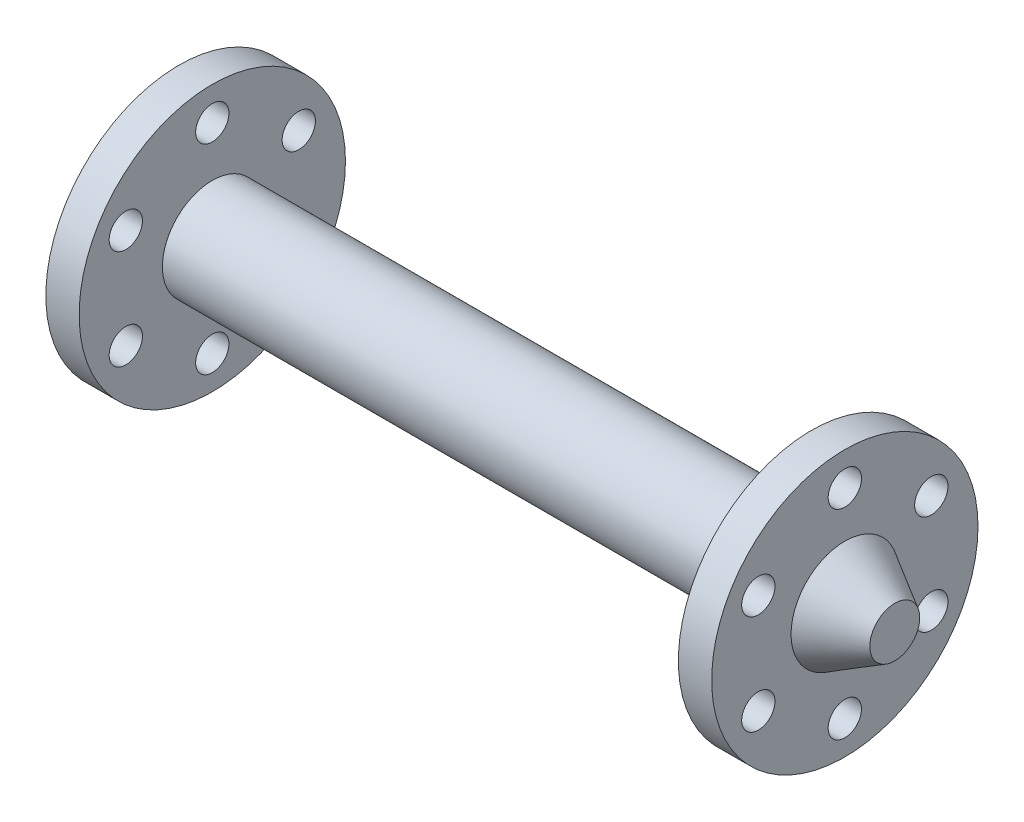
ISO-10303-21;
HEADER;
FILE_DESCRIPTION(('STEP AP214'),'2;1');
FILE_NAME('part.step','',(''),(''),'','','');
FILE_SCHEMA(('AUTOMOTIVE_DESIGN { 1 0 10303 214 1 1 1 1 }'));
ENDSEC;
DATA;
#1=APPLICATION_CONTEXT('core data for automotive mechanical design processes');
#2=APPLICATION_PROTOCOL_DEFINITION('international standard','automotive_design',2000,#1);
#3=PRODUCT_CONTEXT('',#1,'mechanical');
#4=PRODUCT('Part','Part','',(#3));
#5=PRODUCT_RELATED_PRODUCT_CATEGORY('part','',(#4));
#6=PRODUCT_DEFINITION_FORMATION('','',#4);
#7=PRODUCT_DEFINITION_CONTEXT('part definition',#1,'design');
#8=PRODUCT_DEFINITION('design','',#6,#7);
#9=PRODUCT_DEFINITION_SHAPE('','',#8);
#10=(LENGTH_UNIT() NAMED_UNIT(*) SI_UNIT(.MILLI.,.METRE.));
#11=(NAMED_UNIT(*) PLANE_ANGLE_UNIT() SI_UNIT($,.RADIAN.));
#12=(NAMED_UNIT(*) SI_UNIT($,.STERADIAN.) SOLID_ANGLE_UNIT());
#13=UNCERTAINTY_MEASURE_WITH_UNIT(LENGTH_MEASURE(1.E-05),#10,'distance_accuracy_value','');
#14=(GEOMETRIC_REPRESENTATION_CONTEXT(3) GLOBAL_UNCERTAINTY_ASSIGNED_CONTEXT((#13)) GLOBAL_UNIT_ASSIGNED_CONTEXT((#10,
#11,#12)) REPRESENTATION_CONTEXT('',''));
#15=CARTESIAN_POINT('',(0.,0.,0.));
#16=DIRECTION('',(0.,0.,1.));
#17=DIRECTION('',(1.,0.,0.));
#18=AXIS2_PLACEMENT_3D('',#15,#16,#17);
#19=CARTESIAN_POINT('',(0.,0.,0.));
#20=DIRECTION('',(1.,0.,0.));
#21=DIRECTION('',(0.,0.,-1.));
#22=AXIS2_PLACEMENT_3D('',#19,#20,#21);
#23=PLANE('',#22);
#24=CARTESIAN_POINT('',(0.,0.,0.));
#25=DIRECTION('',(-1.,0.,0.));
#26=DIRECTION('',(0.,0.,1.));
#27=AXIS2_PLACEMENT_3D('',#24,#25,#26);
#28=CIRCLE('',#27,15.);
#29=CARTESIAN_POINT('',(0.,0.,15.));
#30=VERTEX_POINT('',#29);
#31=EDGE_CURVE('E10',#30,#30,#28,.T.);
#32=ORIENTED_EDGE('',*,*,#31,.T.);
#33=EDGE_LOOP('',(#32));
#34=FACE_BOUND('',#33,.T.);
#35=ADVANCED_FACE('F43',(#34),#23,.F.);
#36=CARTESIAN_POINT('',(30.,0.,0.));
#37=DIRECTION('',(1.,0.,0.));
#38=DIRECTION('',(0.,0.,-1.));
#39=AXIS2_PLACEMENT_3D('',#36,#37,#38);
#40=CONICAL_SURFACE('',#39,32.3205080756885,0.523598775598293);
#41=ORIENTED_EDGE('',*,*,#31,.F.);
#42=EDGE_LOOP('',(#41));
#43=FACE_BOUND('',#42,.T.);
#44=CARTESIAN_POINT('',(30.,0.,0.));
#45=DIRECTION('',(-1.,0.,0.));
#46=DIRECTION('',(0.,0.,1.));
#47=AXIS2_PLACEMENT_3D('',#44,#45,#46);
#48=CIRCLE('',#47,32.3205080756885);
#49=CARTESIAN_POINT('',(30.,0.,32.3205080756885));
#50=VERTEX_POINT('',#49);
#51=EDGE_CURVE('E50',#50,#50,#48,.T.);
#52=ORIENTED_EDGE('',*,*,#51,.T.);
#53=EDGE_LOOP('',(#52));
#54=FACE_BOUND('',#53,.T.);
#55=ADVANCED_FACE('F203',(#43,#54),#40,.T.);
#56=CARTESIAN_POINT('',(50.,0.,0.));
#57=DIRECTION('',(-1.,0.,0.));
#58=DIRECTION('',(0.,0.,1.));
#59=AXIS2_PLACEMENT_3D('',#56,#57,#58);
#60=CYLINDRICAL_SURFACE('',#59,80.);
#61=CARTESIAN_POINT('',(50.,0.,0.));
#62=DIRECTION('',(1.,0.,0.));
#63=DIRECTION('',(0.,0.,-1.));
#64=AXIS2_PLACEMENT_3D('',#61,#62,#63);
#65=CIRCLE('',#64,80.);
#66=CARTESIAN_POINT('',(50.,0.,-80.));
#67=VERTEX_POINT('',#66);
#68=EDGE_CURVE('E55',#67,#67,#65,.T.);
#69=ORIENTED_EDGE('',*,*,#68,.F.);
#70=EDGE_LOOP('',(#69));
#71=FACE_BOUND('',#70,.T.);
#72=CARTESIAN_POINT('',(30.,0.,0.));
#73=DIRECTION('',(1.,0.,0.));
#74=DIRECTION('',(0.,0.,-1.));
#75=AXIS2_PLACEMENT_3D('',#72,#73,#74);
#76=CIRCLE('',#75,80.);
#77=CARTESIAN_POINT('',(30.,0.,-80.));
#78=VERTEX_POINT('',#77);
#79=EDGE_CURVE('E60',#78,#78,#76,.T.);
#80=ORIENTED_EDGE('',*,*,#79,.T.);
#81=EDGE_LOOP('',(#80));
#82=FACE_BOUND('',#81,.T.);
#83=ADVANCED_FACE('F207',(#71,#82),#60,.T.);
#84=CARTESIAN_POINT('',(50.,0.,0.));
#85=DIRECTION('',(1.,0.,0.));
#86=DIRECTION('',(0.,0.,-1.));
#87=AXIS2_PLACEMENT_3D('',#84,#85,#86);
#88=PLANE('',#87);
#89=CARTESIAN_POINT('',(50.,0.,0.));
#90=DIRECTION('',(1.,0.,0.));
#91=DIRECTION('',(0.,0.,-1.));
#92=AXIS2_PLACEMENT_3D('',#89,#90,#91);
#93=CIRCLE('',#92,30.);
#94=CARTESIAN_POINT('',(50.,0.,-30.));
#95=VERTEX_POINT('',#94);
#96=EDGE_CURVE('E115',#95,#95,#93,.T.);
#97=ORIENTED_EDGE('',*,*,#96,.F.);
#98=EDGE_LOOP('',(#97));
#99=FACE_BOUND('',#98,.T.);
#100=CARTESIAN_POINT('',(50.,60.,0.));
#101=DIRECTION('',(-1.,0.,0.));
#102=DIRECTION('',(0.,0.,1.));
#103=AXIS2_PLACEMENT_3D('',#100,#101,#102);
#104=CIRCLE('',#103,10.);
#105=CARTESIAN_POINT('',(50.,60.,10.));
#106=VERTEX_POINT('',#105);
#107=EDGE_CURVE('E65',#106,#106,#104,.T.);
#108=ORIENTED_EDGE('',*,*,#107,.T.);
#109=EDGE_LOOP('',(#108));
#110=FACE_BOUND('',#109,.T.);
#111=CARTESIAN_POINT('',(50.,30.0000000000006,-51.961524227066));
#112=DIRECTION('',(-1.,0.,0.));
#113=DIRECTION('',(0.,0.,1.));
#114=AXIS2_PLACEMENT_3D('',#111,#112,#113);
#115=CIRCLE('',#114,10.);
#116=CARTESIAN_POINT('',(50.,30.0000000000006,-41.961524227066));
#117=VERTEX_POINT('',#116);
#118=EDGE_CURVE('E101',#117,#117,#115,.T.);
#119=ORIENTED_EDGE('',*,*,#118,.T.);
#120=EDGE_LOOP('',(#119));
#121=FACE_BOUND('',#120,.T.);
#122=CARTESIAN_POINT('',(50.,-29.9999999999995,-51.9615242270666));
#123=DIRECTION('',(-1.,0.,0.));
#124=DIRECTION('',(0.,0.,1.));
#125=AXIS2_PLACEMENT_3D('',#122,#123,#124);
#126=CIRCLE('',#125,9.99999999999999);
#127=CARTESIAN_POINT('',(50.,-29.9999999999995,-41.9615242270666));
#128=VERTEX_POINT('',#127);
#129=EDGE_CURVE('E67',#128,#128,#126,.T.);
#130=ORIENTED_EDGE('',*,*,#129,.T.);
#131=EDGE_LOOP('',(#130));
#132=FACE_BOUND('',#131,.T.);
#133=CARTESIAN_POINT('',(50.,-60.,-4.18977760661176E-13));
#134=DIRECTION('',(-1.,0.,0.));
#135=DIRECTION('',(0.,0.,1.));
#136=AXIS2_PLACEMENT_3D('',#133,#134,#135);
#137=CIRCLE('',#136,10.);
#138=CARTESIAN_POINT('',(50.,-60.,9.99999999999958));
#139=VERTEX_POINT('',#138);
#140=EDGE_CURVE('E76',#139,#139,#137,.T.);
#141=ORIENTED_EDGE('',*,*,#140,.T.);
#142=EDGE_LOOP('',(#141));
#143=FACE_BOUND('',#142,.T.);
#144=CARTESIAN_POINT('',(50.,-30.0000000000002,51.9615242270662));
#145=DIRECTION('',(-1.,0.,0.));
#146=DIRECTION('',(0.,0.,1.));
#147=AXIS2_PLACEMENT_3D('',#144,#145,#146);
#148=CIRCLE('',#147,10.);
#149=CARTESIAN_POINT('',(50.,-30.0000000000002,61.9615242270662));
#150=VERTEX_POINT('',#149);
#151=EDGE_CURVE('E84',#150,#150,#148,.T.);
#152=ORIENTED_EDGE('',*,*,#151,.T.);
#153=EDGE_LOOP('',(#152));
#154=FACE_BOUND('',#153,.T.);
#155=CARTESIAN_POINT('',(50.,29.9999999999999,51.9615242270664));
#156=DIRECTION('',(-1.,0.,0.));
#157=DIRECTION('',(0.,0.,1.));
#158=AXIS2_PLACEMENT_3D('',#155,#156,#157);
#159=CIRCLE('',#158,10.);
#160=CARTESIAN_POINT('',(50.,29.9999999999999,61.9615242270664));
#161=VERTEX_POINT('',#160);
#162=EDGE_CURVE('E92',#161,#161,#159,.T.);
#163=ORIENTED_EDGE('',*,*,#162,.T.);
#164=EDGE_LOOP('',(#163));
#165=FACE_BOUND('',#164,.T.);
#166=ORIENTED_EDGE('',*,*,#68,.T.);
#167=EDGE_LOOP('',(#166));
#168=FACE_BOUND('',#167,.T.);
#169=ADVANCED_FACE('F212',(#99,#110,#121,#132,#143,#154,#165,#168),#88,.T.);
#170=CARTESIAN_POINT('',(30.,0.,0.));
#171=DIRECTION('',(1.,0.,0.));
#172=DIRECTION('',(0.,0.,-1.));
#173=AXIS2_PLACEMENT_3D('',#170,#171,#172);
#174=PLANE('',#173);
#175=CARTESIAN_POINT('',(30.,60.,0.));
#176=DIRECTION('',(-1.,0.,0.));
#177=DIRECTION('',(0.,0.,1.));
#178=AXIS2_PLACEMENT_3D('',#175,#176,#177);
#179=CIRCLE('',#178,10.);
#180=CARTESIAN_POINT('',(30.,60.,10.));
#181=VERTEX_POINT('',#180);
#182=EDGE_CURVE('E100',#181,#181,#179,.T.);
#183=ORIENTED_EDGE('',*,*,#182,.F.);
#184=EDGE_LOOP('',(#183));
#185=FACE_BOUND('',#184,.T.);
#186=CARTESIAN_POINT('',(30.,30.0000000000006,-51.961524227066));
#187=DIRECTION('',(-1.,0.,0.));
#188=DIRECTION('',(0.,0.,1.));
#189=AXIS2_PLACEMENT_3D('',#186,#187,#188);
#190=CIRCLE('',#189,10.);
#191=CARTESIAN_POINT('',(30.,30.0000000000006,-41.961524227066));
#192=VERTEX_POINT('',#191);
#193=EDGE_CURVE('E72',#192,#192,#190,.T.);
#194=ORIENTED_EDGE('',*,*,#193,.F.);
#195=EDGE_LOOP('',(#194));
#196=FACE_BOUND('',#195,.T.);
#197=CARTESIAN_POINT('',(30.,-29.9999999999995,-51.9615242270666));
#198=DIRECTION('',(-1.,0.,0.));
#199=DIRECTION('',(0.,0.,1.));
#200=AXIS2_PLACEMENT_3D('',#197,#198,#199);
#201=CIRCLE('',#200,9.99999999999999);
#202=CARTESIAN_POINT('',(30.,-29.9999999999995,-41.9615242270666));
#203=VERTEX_POINT('',#202);
#204=EDGE_CURVE('E71',#203,#203,#201,.T.);
#205=ORIENTED_EDGE('',*,*,#204,.F.);
#206=EDGE_LOOP('',(#205));
#207=FACE_BOUND('',#206,.T.);
#208=CARTESIAN_POINT('',(30.,-60.,-4.18977760661176E-13));
#209=DIRECTION('',(-1.,0.,0.));
#210=DIRECTION('',(0.,0.,1.));
#211=AXIS2_PLACEMENT_3D('',#208,#209,#210);
#212=CIRCLE('',#211,10.);
#213=CARTESIAN_POINT('',(30.,-60.,9.99999999999958));
#214=VERTEX_POINT('',#213);
#215=EDGE_CURVE('E80',#214,#214,#212,.T.);
#216=ORIENTED_EDGE('',*,*,#215,.F.);
#217=EDGE_LOOP('',(#216));
#218=FACE_BOUND('',#217,.T.);
#219=CARTESIAN_POINT('',(30.,-30.0000000000002,51.9615242270662));
#220=DIRECTION('',(-1.,0.,0.));
#221=DIRECTION('',(0.,0.,1.));
#222=AXIS2_PLACEMENT_3D('',#219,#220,#221);
#223=CIRCLE('',#222,10.);
#224=CARTESIAN_POINT('',(30.,-30.0000000000002,61.9615242270662));
#225=VERTEX_POINT('',#224);
#226=EDGE_CURVE('E88',#225,#225,#223,.T.);
#227=ORIENTED_EDGE('',*,*,#226,.F.);
#228=EDGE_LOOP('',(#227));
#229=FACE_BOUND('',#228,.T.);
#230=CARTESIAN_POINT('',(30.,29.9999999999999,51.9615242270664));
#231=DIRECTION('',(-1.,0.,0.));
#232=DIRECTION('',(0.,0.,1.));
#233=AXIS2_PLACEMENT_3D('',#230,#231,#232);
#234=CIRCLE('',#233,10.);
#235=CARTESIAN_POINT('',(30.,29.9999999999999,61.9615242270664));
#236=VERTEX_POINT('',#235);
#237=EDGE_CURVE('E96',#236,#236,#234,.T.);
#238=ORIENTED_EDGE('',*,*,#237,.F.);
#239=EDGE_LOOP('',(#238));
#240=FACE_BOUND('',#239,.T.);
#241=ORIENTED_EDGE('',*,*,#51,.F.);
#242=EDGE_LOOP('',(#241));
#243=FACE_BOUND('',#242,.T.);
#244=ORIENTED_EDGE('',*,*,#79,.F.);
#245=EDGE_LOOP('',(#244));
#246=FACE_BOUND('',#245,.T.);
#247=ADVANCED_FACE('F216',(#185,#196,#207,#218,#229,#240,#243,#246),#174,.F.);
#248=CARTESIAN_POINT('',(50.,29.9999999999999,51.9615242270664));
#249=DIRECTION('',(-1.,0.,0.));
#250=DIRECTION('',(0.,0.,1.));
#251=AXIS2_PLACEMENT_3D('',#248,#249,#250);
#252=CYLINDRICAL_SURFACE('',#251,10.);
#253=ORIENTED_EDGE('',*,*,#162,.F.);
#254=EDGE_LOOP('',(#253));
#255=FACE_BOUND('',#254,.T.);
#256=ORIENTED_EDGE('',*,*,#237,.T.);
#257=EDGE_LOOP('',(#256));
#258=FACE_BOUND('',#257,.T.);
#259=ADVANCED_FACE('F219',(#255,#258),#252,.F.);
#260=CARTESIAN_POINT('',(50.,-30.0000000000002,51.9615242270662));
#261=DIRECTION('',(-1.,0.,0.));
#262=DIRECTION('',(0.,0.,1.));
#263=AXIS2_PLACEMENT_3D('',#260,#261,#262);
#264=CYLINDRICAL_SURFACE('',#263,10.);
#265=ORIENTED_EDGE('',*,*,#151,.F.);
#266=EDGE_LOOP('',(#265));
#267=FACE_BOUND('',#266,.T.);
#268=ORIENTED_EDGE('',*,*,#226,.T.);
#269=EDGE_LOOP('',(#268));
#270=FACE_BOUND('',#269,.T.);
#271=ADVANCED_FACE('F232',(#267,#270),#264,.F.);
#272=CARTESIAN_POINT('',(50.,-60.,-4.18977760661176E-13));
#273=DIRECTION('',(-1.,0.,0.));
#274=DIRECTION('',(0.,0.,1.));
#275=AXIS2_PLACEMENT_3D('',#272,#273,#274);
#276=CYLINDRICAL_SURFACE('',#275,10.);
#277=ORIENTED_EDGE('',*,*,#140,.F.);
#278=EDGE_LOOP('',(#277));
#279=FACE_BOUND('',#278,.T.);
#280=ORIENTED_EDGE('',*,*,#215,.T.);
#281=EDGE_LOOP('',(#280));
#282=FACE_BOUND('',#281,.T.);
#283=ADVANCED_FACE('F228',(#279,#282),#276,.F.);
#284=CARTESIAN_POINT('',(50.,-29.9999999999995,-51.9615242270666));
#285=DIRECTION('',(-1.,0.,0.));
#286=DIRECTION('',(0.,0.,1.));
#287=AXIS2_PLACEMENT_3D('',#284,#285,#286);
#288=CYLINDRICAL_SURFACE('',#287,9.99999999999999);
#289=ORIENTED_EDGE('',*,*,#129,.F.);
#290=EDGE_LOOP('',(#289));
#291=FACE_BOUND('',#290,.T.);
#292=ORIENTED_EDGE('',*,*,#204,.T.);
#293=EDGE_LOOP('',(#292));
#294=FACE_BOUND('',#293,.T.);
#295=ADVANCED_FACE('F224',(#291,#294),#288,.F.);
#296=CARTESIAN_POINT('',(50.,30.0000000000006,-51.961524227066));
#297=DIRECTION('',(-1.,0.,0.));
#298=DIRECTION('',(0.,0.,1.));
#299=AXIS2_PLACEMENT_3D('',#296,#297,#298);
#300=CYLINDRICAL_SURFACE('',#299,10.);
#301=ORIENTED_EDGE('',*,*,#118,.F.);
#302=EDGE_LOOP('',(#301));
#303=FACE_BOUND('',#302,.T.);
#304=ORIENTED_EDGE('',*,*,#193,.T.);
#305=EDGE_LOOP('',(#304));
#306=FACE_BOUND('',#305,.T.);
#307=ADVANCED_FACE('F227',(#303,#306),#300,.F.);
#308=CARTESIAN_POINT('',(50.,60.,0.));
#309=DIRECTION('',(-1.,0.,0.));
#310=DIRECTION('',(0.,0.,1.));
#311=AXIS2_PLACEMENT_3D('',#308,#309,#310);
#312=CYLINDRICAL_SURFACE('',#311,10.);
#313=ORIENTED_EDGE('',*,*,#107,.F.);
#314=EDGE_LOOP('',(#313));
#315=FACE_BOUND('',#314,.T.);
#316=ORIENTED_EDGE('',*,*,#182,.T.);
#317=EDGE_LOOP('',(#316));
#318=FACE_BOUND('',#317,.T.);
#319=ADVANCED_FACE('F242',(#315,#318),#312,.F.);
#320=CARTESIAN_POINT('',(410.,0.,0.));
#321=DIRECTION('',(-1.,0.,0.));
#322=DIRECTION('',(0.,0.,1.));
#323=AXIS2_PLACEMENT_3D('',#320,#321,#322);
#324=CYLINDRICAL_SURFACE('',#323,30.);
#325=CARTESIAN_POINT('',(410.,0.,0.));
#326=DIRECTION('',(1.,0.,0.));
#327=DIRECTION('',(0.,0.,-1.));
#328=AXIS2_PLACEMENT_3D('',#325,#326,#327);
#329=CIRCLE('',#328,30.);
#330=CARTESIAN_POINT('',(410.,0.,-30.));
#331=VERTEX_POINT('',#330);
#332=EDGE_CURVE('E105',#331,#331,#329,.T.);
#333=ORIENTED_EDGE('',*,*,#332,.F.);
#334=EDGE_LOOP('',(#333));
#335=FACE_BOUND('',#334,.T.);
#336=ORIENTED_EDGE('',*,*,#96,.T.);
#337=EDGE_LOOP('',(#336));
#338=FACE_BOUND('',#337,.T.);
#339=ADVANCED_FACE('F246',(#335,#338),#324,.T.);
#340=CARTESIAN_POINT('',(430.,0.,0.));
#341=DIRECTION('',(-1.,0.,0.));
#342=DIRECTION('',(0.,0.,1.));
#343=AXIS2_PLACEMENT_3D('',#340,#341,#342);
#344=CYLINDRICAL_SURFACE('',#343,80.);
#345=CARTESIAN_POINT('',(430.,0.,0.));
#346=DIRECTION('',(1.,0.,0.));
#347=DIRECTION('',(0.,0.,-1.));
#348=AXIS2_PLACEMENT_3D('',#345,#346,#347);
#349=CIRCLE('',#348,80.);
#350=CARTESIAN_POINT('',(430.,0.,-80.));
#351=VERTEX_POINT('',#350);
#352=EDGE_CURVE('E119',#351,#351,#349,.T.);
#353=ORIENTED_EDGE('',*,*,#352,.F.);
#354=EDGE_LOOP('',(#353));
#355=FACE_BOUND('',#354,.T.);
#356=CARTESIAN_POINT('',(410.,0.,0.));
#357=DIRECTION('',(1.,0.,0.));
#358=DIRECTION('',(0.,0.,-1.));
#359=AXIS2_PLACEMENT_3D('',#356,#357,#358);
#360=CIRCLE('',#359,80.);
#361=CARTESIAN_POINT('',(410.,0.,-80.));
#362=VERTEX_POINT('',#361);
#363=EDGE_CURVE('E123',#362,#362,#360,.T.);
#364=ORIENTED_EDGE('',*,*,#363,.T.);
#365=EDGE_LOOP('',(#364));
#366=FACE_BOUND('',#365,.T.);
#367=ADVANCED_FACE('F250',(#355,#366),#344,.T.);
#368=CARTESIAN_POINT('',(430.,0.,0.));
#369=DIRECTION('',(1.,0.,0.));
#370=DIRECTION('',(0.,0.,-1.));
#371=AXIS2_PLACEMENT_3D('',#368,#369,#370);
#372=PLANE('',#371);
#373=CARTESIAN_POINT('',(430.,0.,0.));
#374=DIRECTION('',(-1.,0.,0.));
#375=DIRECTION('',(0.,0.,1.));
#376=AXIS2_PLACEMENT_3D('',#373,#374,#375);
#377=CIRCLE('',#376,32.3205080756885);
#378=CARTESIAN_POINT('',(430.,0.,32.3205080756885));
#379=VERTEX_POINT('',#378);
#380=EDGE_CURVE('E182',#379,#379,#377,.T.);
#381=ORIENTED_EDGE('',*,*,#380,.T.);
#382=EDGE_LOOP('',(#381));
#383=FACE_BOUND('',#382,.T.);
#384=CARTESIAN_POINT('',(430.,60.,0.));
#385=DIRECTION('',(1.,0.,0.));
#386=DIRECTION('',(0.,0.,-1.));
#387=AXIS2_PLACEMENT_3D('',#384,#385,#386);
#388=CIRCLE('',#387,10.);
#389=CARTESIAN_POINT('',(430.,60.,-10.));
#390=VERTEX_POINT('',#389);
#391=EDGE_CURVE('E164',#390,#390,#388,.T.);
#392=ORIENTED_EDGE('',*,*,#391,.F.);
#393=EDGE_LOOP('',(#392));
#394=FACE_BOUND('',#393,.T.);
#395=CARTESIAN_POINT('',(430.,30.0000000000006,51.961524227066));
#396=DIRECTION('',(1.,0.,0.));
#397=DIRECTION('',(0.,0.,-1.));
#398=AXIS2_PLACEMENT_3D('',#395,#396,#397);
#399=CIRCLE('',#398,10.);
#400=CARTESIAN_POINT('',(430.,30.0000000000006,41.961524227066));
#401=VERTEX_POINT('',#400);
#402=EDGE_CURVE('E136',#401,#401,#399,.T.);
#403=ORIENTED_EDGE('',*,*,#402,.F.);
#404=EDGE_LOOP('',(#403));
#405=FACE_BOUND('',#404,.T.);
#406=CARTESIAN_POINT('',(430.,-29.9999999999995,51.9615242270666));
#407=DIRECTION('',(1.,0.,0.));
#408=DIRECTION('',(0.,0.,-1.));
#409=AXIS2_PLACEMENT_3D('',#406,#407,#408);
#410=CIRCLE('',#409,9.99999999999999);
#411=CARTESIAN_POINT('',(430.,-29.9999999999995,41.9615242270666));
#412=VERTEX_POINT('',#411);
#413=EDGE_CURVE('E135',#412,#412,#410,.T.);
#414=ORIENTED_EDGE('',*,*,#413,.F.);
#415=EDGE_LOOP('',(#414));
#416=FACE_BOUND('',#415,.T.);
#417=CARTESIAN_POINT('',(430.,-60.,4.18977760661176E-13));
#418=DIRECTION('',(1.,0.,0.));
#419=DIRECTION('',(0.,0.,-1.));
#420=AXIS2_PLACEMENT_3D('',#417,#418,#419);
#421=CIRCLE('',#420,10.);
#422=CARTESIAN_POINT('',(430.,-60.,-9.99999999999958));
#423=VERTEX_POINT('',#422);
#424=EDGE_CURVE('E144',#423,#423,#421,.T.);
#425=ORIENTED_EDGE('',*,*,#424,.F.);
#426=EDGE_LOOP('',(#425));
#427=FACE_BOUND('',#426,.T.);
#428=CARTESIAN_POINT('',(430.,-30.0000000000002,-51.9615242270662));
#429=DIRECTION('',(1.,0.,0.));
#430=DIRECTION('',(0.,0.,-1.));
#431=AXIS2_PLACEMENT_3D('',#428,#429,#430);
#432=CIRCLE('',#431,10.);
#433=CARTESIAN_POINT('',(430.,-30.0000000000002,-61.9615242270662));
#434=VERTEX_POINT('',#433);
#435=EDGE_CURVE('E152',#434,#434,#432,.T.);
#436=ORIENTED_EDGE('',*,*,#435,.F.);
#437=EDGE_LOOP('',(#436));
#438=FACE_BOUND('',#437,.T.);
#439=CARTESIAN_POINT('',(430.,29.9999999999999,-51.9615242270664));
#440=DIRECTION('',(1.,0.,0.));
#441=DIRECTION('',(0.,0.,-1.));
#442=AXIS2_PLACEMENT_3D('',#439,#440,#441);
#443=CIRCLE('',#442,10.);
#444=CARTESIAN_POINT('',(430.,29.9999999999999,-61.9615242270664));
#445=VERTEX_POINT('',#444);
#446=EDGE_CURVE('E160',#445,#445,#443,.T.);
#447=ORIENTED_EDGE('',*,*,#446,.F.);
#448=EDGE_LOOP('',(#447));
#449=FACE_BOUND('',#448,.T.);
#450=ORIENTED_EDGE('',*,*,#352,.T.);
#451=EDGE_LOOP('',(#450));
#452=FACE_BOUND('',#451,.T.);
#453=ADVANCED_FACE('F187',(#383,#394,#405,#416,#427,#438,#449,#452),#372,.T.);
#454=CARTESIAN_POINT('',(410.,0.,0.));
#455=DIRECTION('',(1.,0.,0.));
#456=DIRECTION('',(0.,0.,-1.));
#457=AXIS2_PLACEMENT_3D('',#454,#455,#456);
#458=PLANE('',#457);
#459=CARTESIAN_POINT('',(410.,60.,0.));
#460=DIRECTION('',(1.,0.,0.));
#461=DIRECTION('',(0.,0.,-1.));
#462=AXIS2_PLACEMENT_3D('',#459,#460,#461);
#463=CIRCLE('',#462,10.);
#464=CARTESIAN_POINT('',(410.,60.,-10.));
#465=VERTEX_POINT('',#464);
#466=EDGE_CURVE('E127',#465,#465,#463,.T.);
#467=ORIENTED_EDGE('',*,*,#466,.T.);
#468=EDGE_LOOP('',(#467));
#469=FACE_BOUND('',#468,.T.);
#470=CARTESIAN_POINT('',(410.,30.0000000000006,51.961524227066));
#471=DIRECTION('',(1.,0.,0.));
#472=DIRECTION('',(0.,0.,-1.));
#473=AXIS2_PLACEMENT_3D('',#470,#471,#472);
#474=CIRCLE('',#473,10.);
#475=CARTESIAN_POINT('',(410.,30.0000000000006,41.961524227066));
#476=VERTEX_POINT('',#475);
#477=EDGE_CURVE('E165',#476,#476,#474,.T.);
#478=ORIENTED_EDGE('',*,*,#477,.T.);
#479=EDGE_LOOP('',(#478));
#480=FACE_BOUND('',#479,.T.);
#481=CARTESIAN_POINT('',(410.,-29.9999999999995,51.9615242270666));
#482=DIRECTION('',(1.,0.,0.));
#483=DIRECTION('',(0.,0.,-1.));
#484=AXIS2_PLACEMENT_3D('',#481,#482,#483);
#485=CIRCLE('',#484,9.99999999999999);
#486=CARTESIAN_POINT('',(410.,-29.9999999999995,41.9615242270666));
#487=VERTEX_POINT('',#486);
#488=EDGE_CURVE('E131',#487,#487,#485,.T.);
#489=ORIENTED_EDGE('',*,*,#488,.T.);
#490=EDGE_LOOP('',(#489));
#491=FACE_BOUND('',#490,.T.);
#492=CARTESIAN_POINT('',(410.,-60.,4.18977760661176E-13));
#493=DIRECTION('',(1.,0.,0.));
#494=DIRECTION('',(0.,0.,-1.));
#495=AXIS2_PLACEMENT_3D('',#492,#493,#494);
#496=CIRCLE('',#495,10.);
#497=CARTESIAN_POINT('',(410.,-60.,-9.99999999999958));
#498=VERTEX_POINT('',#497);
#499=EDGE_CURVE('E140',#498,#498,#496,.T.);
#500=ORIENTED_EDGE('',*,*,#499,.T.);
#501=EDGE_LOOP('',(#500));
#502=FACE_BOUND('',#501,.T.);
#503=CARTESIAN_POINT('',(410.,-30.0000000000002,-51.9615242270662));
#504=DIRECTION('',(1.,0.,0.));
#505=DIRECTION('',(0.,0.,-1.));
#506=AXIS2_PLACEMENT_3D('',#503,#504,#505);
#507=CIRCLE('',#506,10.);
#508=CARTESIAN_POINT('',(410.,-30.0000000000002,-61.9615242270662));
#509=VERTEX_POINT('',#508);
#510=EDGE_CURVE('E148',#509,#509,#507,.T.);
#511=ORIENTED_EDGE('',*,*,#510,.T.);
#512=EDGE_LOOP('',(#511));
#513=FACE_BOUND('',#512,.T.);
#514=CARTESIAN_POINT('',(410.,29.9999999999999,-51.9615242270664));
#515=DIRECTION('',(1.,0.,0.));
#516=DIRECTION('',(0.,0.,-1.));
#517=AXIS2_PLACEMENT_3D('',#514,#515,#516);
#518=CIRCLE('',#517,10.);
#519=CARTESIAN_POINT('',(410.,29.9999999999999,-61.9615242270664));
#520=VERTEX_POINT('',#519);
#521=EDGE_CURVE('E156',#520,#520,#518,.T.);
#522=ORIENTED_EDGE('',*,*,#521,.T.);
#523=EDGE_LOOP('',(#522));
#524=FACE_BOUND('',#523,.T.);
#525=ORIENTED_EDGE('',*,*,#332,.T.);
#526=EDGE_LOOP('',(#525));
#527=FACE_BOUND('',#526,.T.);
#528=ORIENTED_EDGE('',*,*,#363,.F.);
#529=EDGE_LOOP('',(#528));
#530=FACE_BOUND('',#529,.T.);
#531=ADVANCED_FACE('F255',(#469,#480,#491,#502,#513,#524,#527,#530),#458,.F.);
#532=CARTESIAN_POINT('',(410.,29.9999999999999,-51.9615242270664));
#533=DIRECTION('',(1.,0.,0.));
#534=DIRECTION('',(0.,0.,-1.));
#535=AXIS2_PLACEMENT_3D('',#532,#533,#534);
#536=CYLINDRICAL_SURFACE('',#535,10.);
#537=ORIENTED_EDGE('',*,*,#521,.F.);
#538=EDGE_LOOP('',(#537));
#539=FACE_BOUND('',#538,.T.);
#540=ORIENTED_EDGE('',*,*,#446,.T.);
#541=EDGE_LOOP('',(#540));
#542=FACE_BOUND('',#541,.T.);
#543=ADVANCED_FACE('F258',(#539,#542),#536,.F.);
#544=CARTESIAN_POINT('',(410.,-30.0000000000002,-51.9615242270662));
#545=DIRECTION('',(1.,0.,0.));
#546=DIRECTION('',(0.,0.,-1.));
#547=AXIS2_PLACEMENT_3D('',#544,#545,#546);
#548=CYLINDRICAL_SURFACE('',#547,10.);
#549=ORIENTED_EDGE('',*,*,#510,.F.);
#550=EDGE_LOOP('',(#549));
#551=FACE_BOUND('',#550,.T.);
#552=ORIENTED_EDGE('',*,*,#435,.T.);
#553=EDGE_LOOP('',(#552));
#554=FACE_BOUND('',#553,.T.);
#555=ADVANCED_FACE('F270',(#551,#554),#548,.F.);
#556=CARTESIAN_POINT('',(410.,-60.,4.18977760661176E-13));
#557=DIRECTION('',(1.,0.,0.));
#558=DIRECTION('',(0.,0.,-1.));
#559=AXIS2_PLACEMENT_3D('',#556,#557,#558);
#560=CYLINDRICAL_SURFACE('',#559,10.);
#561=ORIENTED_EDGE('',*,*,#499,.F.);
#562=EDGE_LOOP('',(#561));
#563=FACE_BOUND('',#562,.T.);
#564=ORIENTED_EDGE('',*,*,#424,.T.);
#565=EDGE_LOOP('',(#564));
#566=FACE_BOUND('',#565,.T.);
#567=ADVANCED_FACE('F266',(#563,#566),#560,.F.);
#568=CARTESIAN_POINT('',(410.,-29.9999999999995,51.9615242270666));
#569=DIRECTION('',(1.,0.,0.));
#570=DIRECTION('',(0.,0.,-1.));
#571=AXIS2_PLACEMENT_3D('',#568,#569,#570);
#572=CYLINDRICAL_SURFACE('',#571,9.99999999999999);
#573=ORIENTED_EDGE('',*,*,#488,.F.);
#574=EDGE_LOOP('',(#573));
#575=FACE_BOUND('',#574,.T.);
#576=ORIENTED_EDGE('',*,*,#413,.T.);
#577=EDGE_LOOP('',(#576));
#578=FACE_BOUND('',#577,.T.);
#579=ADVANCED_FACE('F262',(#575,#578),#572,.F.);
#580=CARTESIAN_POINT('',(410.,30.0000000000006,51.961524227066));
#581=DIRECTION('',(1.,0.,0.));
#582=DIRECTION('',(0.,0.,-1.));
#583=AXIS2_PLACEMENT_3D('',#580,#581,#582);
#584=CYLINDRICAL_SURFACE('',#583,10.);
#585=ORIENTED_EDGE('',*,*,#477,.F.);
#586=EDGE_LOOP('',(#585));
#587=FACE_BOUND('',#586,.T.);
#588=ORIENTED_EDGE('',*,*,#402,.T.);
#589=EDGE_LOOP('',(#588));
#590=FACE_BOUND('',#589,.T.);
#591=ADVANCED_FACE('F265',(#587,#590),#584,.F.);
#592=CARTESIAN_POINT('',(410.,60.,0.));
#593=DIRECTION('',(1.,0.,0.));
#594=DIRECTION('',(0.,0.,-1.));
#595=AXIS2_PLACEMENT_3D('',#592,#593,#594);
#596=CYLINDRICAL_SURFACE('',#595,10.);
#597=ORIENTED_EDGE('',*,*,#466,.F.);
#598=EDGE_LOOP('',(#597));
#599=FACE_BOUND('',#598,.T.);
#600=ORIENTED_EDGE('',*,*,#391,.T.);
#601=EDGE_LOOP('',(#600));
#602=FACE_BOUND('',#601,.T.);
#603=ADVANCED_FACE('F194',(#599,#602),#596,.F.);
#604=CARTESIAN_POINT('',(460.,0.,0.));
#605=DIRECTION('',(-1.,0.,0.));
#606=DIRECTION('',(0.,0.,1.));
#607=AXIS2_PLACEMENT_3D('',#604,#605,#606);
#608=CONICAL_SURFACE('',#607,15.,0.523598775598293);
#609=ORIENTED_EDGE('',*,*,#380,.F.);
#610=EDGE_LOOP('',(#609));
#611=FACE_BOUND('',#610,.T.);
#612=CARTESIAN_POINT('',(460.,0.,0.));
#613=DIRECTION('',(-1.,0.,0.));
#614=DIRECTION('',(0.,0.,1.));
#615=AXIS2_PLACEMENT_3D('',#612,#613,#614);
#616=CIRCLE('',#615,15.);
#617=CARTESIAN_POINT('',(460.,0.,15.));
#618=VERTEX_POINT('',#617);
#619=EDGE_CURVE('E169',#618,#618,#616,.T.);
#620=ORIENTED_EDGE('',*,*,#619,.T.);
#621=EDGE_LOOP('',(#620));
#622=FACE_BOUND('',#621,.T.);
#623=ADVANCED_FACE('F190',(#611,#622),#608,.T.);
#624=CARTESIAN_POINT('',(460.,0.,-15.));
#625=DIRECTION('',(-1.,0.,0.));
#626=DIRECTION('',(0.,0.,1.));
#627=AXIS2_PLACEMENT_3D('',#624,#625,#626);
#628=PLANE('',#627);
#629=ORIENTED_EDGE('',*,*,#619,.F.);
#630=EDGE_LOOP('',(#629));
#631=FACE_BOUND('',#630,.T.);
#632=ADVANCED_FACE('F193',(#631),#628,.F.);
#633=CLOSED_SHELL('',(#35,#55,#83,#169,#247,#259,#271,#283,#295,#307,#319,#339,#367,#453,#531,
#543,#555,#567,#579,#591,#603,#623,#632));
#634=MANIFOLD_SOLID_BREP('B2',#633);
#635=ADVANCED_BREP_SHAPE_REPRESENTATION('',(#18,#634),#14);
#636=SHAPE_DEFINITION_REPRESENTATION(#9,#635);
ENDSEC;
END-ISO-10303-21;
